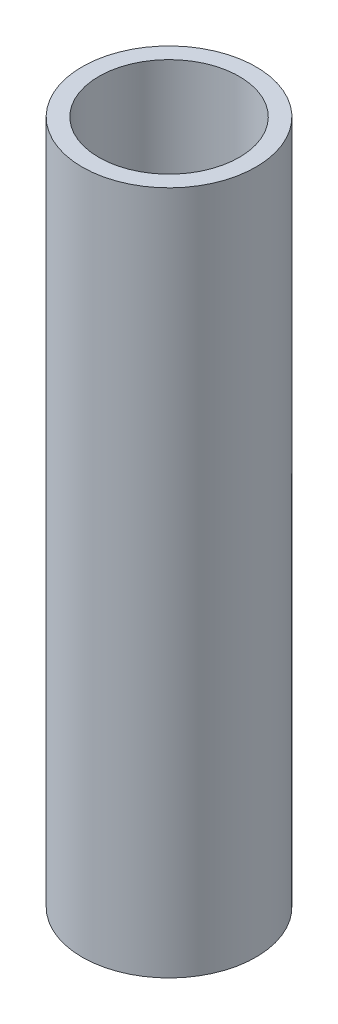
ISO-10303-21;
HEADER;
FILE_DESCRIPTION(('STEP AP214'),'2;1');
FILE_NAME('part.step','',(''),(''),'','','');
FILE_SCHEMA(('AUTOMOTIVE_DESIGN { 1 0 10303 214 1 1 1 1 }'));
ENDSEC;
DATA;
#1=APPLICATION_CONTEXT('core data for automotive mechanical design processes');
#2=APPLICATION_PROTOCOL_DEFINITION('international standard','automotive_design',2000,#1);
#3=PRODUCT_CONTEXT('',#1,'mechanical');
#4=PRODUCT('Part','Part','',(#3));
#5=PRODUCT_RELATED_PRODUCT_CATEGORY('part','',(#4));
#6=PRODUCT_DEFINITION_FORMATION('','',#4);
#7=PRODUCT_DEFINITION_CONTEXT('part definition',#1,'design');
#8=PRODUCT_DEFINITION('design','',#6,#7);
#9=PRODUCT_DEFINITION_SHAPE('','',#8);
#10=(LENGTH_UNIT() NAMED_UNIT(*) SI_UNIT(.MILLI.,.METRE.));
#11=(NAMED_UNIT(*) PLANE_ANGLE_UNIT() SI_UNIT($,.RADIAN.));
#12=(NAMED_UNIT(*) SI_UNIT($,.STERADIAN.) SOLID_ANGLE_UNIT());
#13=UNCERTAINTY_MEASURE_WITH_UNIT(LENGTH_MEASURE(1.E-05),#10,'distance_accuracy_value','');
#14=(GEOMETRIC_REPRESENTATION_CONTEXT(3) GLOBAL_UNCERTAINTY_ASSIGNED_CONTEXT((#13)) GLOBAL_UNIT_ASSIGNED_CONTEXT((#10,
#11,#12)) REPRESENTATION_CONTEXT('',''));
#15=CARTESIAN_POINT('',(0.,0.,0.));
#16=DIRECTION('',(0.,0.,1.));
#17=DIRECTION('',(1.,0.,0.));
#18=AXIS2_PLACEMENT_3D('',#15,#16,#17);
#19=CARTESIAN_POINT('',(0.,26.,0.));
#20=DIRECTION('',(0.,1.,0.));
#21=DIRECTION('',(0.,0.,-1.));
#22=AXIS2_PLACEMENT_3D('',#19,#20,#21);
#23=PLANE('',#22);
#24=CARTESIAN_POINT('',(0.,26.,0.));
#25=DIRECTION('',(0.,-1.,0.));
#26=DIRECTION('',(0.,0.,-1.));
#27=AXIS2_PLACEMENT_3D('',#24,#25,#26);
#28=CIRCLE('',#27,3.302);
#29=CARTESIAN_POINT('',(0.,26.,3.302));
#30=VERTEX_POINT('',#29);
#31=EDGE_CURVE('E10',#30,#30,#28,.T.);
#32=ORIENTED_EDGE('',*,*,#31,.F.);
#33=EDGE_LOOP('',(#32));
#34=FACE_BOUND('',#33,.T.);
#35=CARTESIAN_POINT('',(0.,26.,0.));
#36=DIRECTION('',(0.,-1.,0.));
#37=DIRECTION('',(0.,0.,-1.));
#38=AXIS2_PLACEMENT_3D('',#35,#36,#37);
#39=CIRCLE('',#38,2.667);
#40=CARTESIAN_POINT('',(0.,26.,2.667));
#41=VERTEX_POINT('',#40);
#42=EDGE_CURVE('E49',#41,#41,#39,.T.);
#43=ORIENTED_EDGE('',*,*,#42,.T.);
#44=EDGE_LOOP('',(#43));
#45=FACE_BOUND('',#44,.T.);
#46=ADVANCED_FACE('F36',(#34,#45),#23,.T.);
#47=CARTESIAN_POINT('',(0.,0.,0.));
#48=DIRECTION('',(0.,1.,0.));
#49=DIRECTION('',(0.,0.,-1.));
#50=AXIS2_PLACEMENT_3D('',#47,#48,#49);
#51=PLANE('',#50);
#52=CARTESIAN_POINT('',(0.,0.,0.));
#53=DIRECTION('',(0.,-1.,0.));
#54=DIRECTION('',(0.,0.,-1.));
#55=AXIS2_PLACEMENT_3D('',#52,#53,#54);
#56=CIRCLE('',#55,3.302);
#57=CARTESIAN_POINT('',(0.,0.,3.302));
#58=VERTEX_POINT('',#57);
#59=EDGE_CURVE('E40',#58,#58,#56,.T.);
#60=ORIENTED_EDGE('',*,*,#59,.T.);
#61=EDGE_LOOP('',(#60));
#62=FACE_BOUND('',#61,.T.);
#63=CARTESIAN_POINT('',(0.,0.,0.));
#64=DIRECTION('',(0.,-1.,0.));
#65=DIRECTION('',(0.,0.,-1.));
#66=AXIS2_PLACEMENT_3D('',#63,#64,#65);
#67=CIRCLE('',#66,2.667);
#68=CARTESIAN_POINT('',(0.,0.,2.667));
#69=VERTEX_POINT('',#68);
#70=EDGE_CURVE('E51',#69,#69,#67,.T.);
#71=ORIENTED_EDGE('',*,*,#70,.F.);
#72=EDGE_LOOP('',(#71));
#73=FACE_BOUND('',#72,.T.);
#74=ADVANCED_FACE('F66',(#62,#73),#51,.F.);
#75=CARTESIAN_POINT('',(0.,26.,0.));
#76=DIRECTION('',(0.,-1.,0.));
#77=DIRECTION('',(0.,0.,1.));
#78=AXIS2_PLACEMENT_3D('',#75,#76,#77);
#79=CYLINDRICAL_SURFACE('',#78,3.302);
#80=CARTESIAN_POINT('',(0.,26.,3.302));
#81=CARTESIAN_POINT('',(0.,25.7291666666667,3.302));
#82=CARTESIAN_POINT('',(0.,25.4583333333333,3.302));
#83=CARTESIAN_POINT('',(0.,24.9166666666667,3.302));
#84=CARTESIAN_POINT('',(0.,24.6458333333333,3.302));
#85=CARTESIAN_POINT('',(0.,24.1041666666667,3.302));
#86=CARTESIAN_POINT('',(0.,23.8333333333333,3.302));
#87=CARTESIAN_POINT('',(0.,23.2916666666667,3.302));
#88=CARTESIAN_POINT('',(0.,23.0208333333333,3.302));
#89=CARTESIAN_POINT('',(0.,22.4791666666667,3.302));
#90=CARTESIAN_POINT('',(0.,22.2083333333333,3.302));
#91=CARTESIAN_POINT('',(0.,21.6666666666667,3.302));
#92=CARTESIAN_POINT('',(0.,21.3958333333333,3.302));
#93=CARTESIAN_POINT('',(0.,20.8541666666667,3.302));
#94=CARTESIAN_POINT('',(0.,20.5833333333333,3.302));
#95=CARTESIAN_POINT('',(0.,20.0416666666667,3.302));
#96=CARTESIAN_POINT('',(0.,19.7708333333333,3.302));
#97=CARTESIAN_POINT('',(0.,19.2291666666667,3.302));
#98=CARTESIAN_POINT('',(0.,18.9583333333333,3.302));
#99=CARTESIAN_POINT('',(0.,18.4166666666667,3.302));
#100=CARTESIAN_POINT('',(0.,18.1458333333333,3.302));
#101=CARTESIAN_POINT('',(0.,17.6041666666667,3.302));
#102=CARTESIAN_POINT('',(0.,17.3333333333333,3.302));
#103=CARTESIAN_POINT('',(0.,16.7916666666667,3.302));
#104=CARTESIAN_POINT('',(0.,16.5208333333333,3.302));
#105=CARTESIAN_POINT('',(0.,15.9791666666667,3.302));
#106=CARTESIAN_POINT('',(0.,15.7083333333333,3.302));
#107=CARTESIAN_POINT('',(0.,15.1666666666667,3.302));
#108=CARTESIAN_POINT('',(0.,14.8958333333333,3.302));
#109=CARTESIAN_POINT('',(0.,14.3541666666667,3.302));
#110=CARTESIAN_POINT('',(0.,14.0833333333333,3.302));
#111=CARTESIAN_POINT('',(0.,13.5416666666667,3.302));
#112=CARTESIAN_POINT('',(0.,13.2708333333333,3.302));
#113=CARTESIAN_POINT('',(0.,12.7291666666667,3.302));
#114=CARTESIAN_POINT('',(0.,12.4583333333333,3.302));
#115=CARTESIAN_POINT('',(0.,11.9166666666667,3.302));
#116=CARTESIAN_POINT('',(0.,11.6458333333333,3.302));
#117=CARTESIAN_POINT('',(0.,11.1041666666667,3.302));
#118=CARTESIAN_POINT('',(0.,10.8333333333333,3.302));
#119=CARTESIAN_POINT('',(0.,10.2916666666667,3.302));
#120=CARTESIAN_POINT('',(0.,10.0208333333333,3.302));
#121=CARTESIAN_POINT('',(0.,9.47916666666667,3.302));
#122=CARTESIAN_POINT('',(0.,9.20833333333333,3.302));
#123=CARTESIAN_POINT('',(0.,8.66666666666667,3.302));
#124=CARTESIAN_POINT('',(0.,8.39583333333333,3.302));
#125=CARTESIAN_POINT('',(0.,7.85416666666667,3.302));
#126=CARTESIAN_POINT('',(0.,7.58333333333333,3.302));
#127=CARTESIAN_POINT('',(0.,7.04166666666667,3.302));
#128=CARTESIAN_POINT('',(0.,6.77083333333334,3.302));
#129=CARTESIAN_POINT('',(0.,6.22916666666667,3.302));
#130=CARTESIAN_POINT('',(0.,5.95833333333334,3.302));
#131=CARTESIAN_POINT('',(0.,5.41666666666667,3.302));
#132=CARTESIAN_POINT('',(0.,5.14583333333333,3.302));
#133=CARTESIAN_POINT('',(0.,4.60416666666667,3.302));
#134=CARTESIAN_POINT('',(0.,4.33333333333333,3.302));
#135=CARTESIAN_POINT('',(0.,3.79166666666667,3.302));
#136=CARTESIAN_POINT('',(0.,3.52083333333333,3.302));
#137=CARTESIAN_POINT('',(0.,2.97916666666667,3.302));
#138=CARTESIAN_POINT('',(0.,2.70833333333333,3.302));
#139=CARTESIAN_POINT('',(0.,2.16666666666667,3.302));
#140=CARTESIAN_POINT('',(0.,1.89583333333333,3.302));
#141=CARTESIAN_POINT('',(0.,1.35416666666667,3.302));
#142=CARTESIAN_POINT('',(0.,1.08333333333333,3.302));
#143=CARTESIAN_POINT('',(0.,0.541666666666667,3.302));
#144=CARTESIAN_POINT('',(0.,0.270833333333333,3.302));
#145=CARTESIAN_POINT('',(0.,0.,3.302));
#146=B_SPLINE_CURVE_WITH_KNOTS('',3,(#80,#81,#82,#83,#84,#85,#86,#87,#88,#89,#90,#91,#92,#93,
#94,#95,#96,#97,#98,#99,#100,#101,#102,#103,#104,#105,#106,#107,#108,#109,#110,#111,#112,#113,
#114,#115,#116,#117,#118,#119,#120,#121,#122,#123,#124,#125,#126,#127,#128,#129,#130,#131,#132,
#133,#134,#135,#136,#137,#138,#139,#140,#141,#142,#143,#144,#145),.UNSPECIFIED.,.F.,.F.,(4,2,2,
2,2,2,2,2,2,2,2,2,2,2,2,2,2,2,2,2,2,2,2,2,2,2,2,2,2,2,2,2,4),(0.,0.812500000000001,1.625,2.4375,
3.25,4.0625,4.875,5.6875,6.5,7.3125,8.125,8.9375,9.75,10.5625,11.375,12.1875,13.,13.8125,14.625,
15.4375,16.25,17.0625,17.875,18.6875,19.5,20.3125,21.125,21.9375,22.75,23.5625,24.375,25.1875,
26.),.UNSPECIFIED.);
#147=EDGE_CURVE('BSEAM38',#30,#58,#146,.T.);
#148=ORIENTED_EDGE('',*,*,#31,.T.);
#149=ORIENTED_EDGE('',*,*,#59,.F.);
#150=ORIENTED_EDGE('',*,*,#147,.T.);
#151=ORIENTED_EDGE('',*,*,#147,.F.);
#152=EDGE_LOOP('',(#148,#150,#149,#151));
#153=FACE_BOUND('',#152,.T.);
#154=ADVANCED_FACE('F38',(#153),#79,.T.);
#155=CARTESIAN_POINT('',(0.,26.,0.));
#156=DIRECTION('',(0.,-1.,0.));
#157=DIRECTION('',(0.,0.,1.));
#158=AXIS2_PLACEMENT_3D('',#155,#156,#157);
#159=CYLINDRICAL_SURFACE('',#158,2.667);
#160=CARTESIAN_POINT('',(0.,26.,2.667));
#161=CARTESIAN_POINT('',(0.,25.7291666666667,2.667));
#162=CARTESIAN_POINT('',(0.,25.4583333333333,2.667));
#163=CARTESIAN_POINT('',(0.,24.9166666666667,2.667));
#164=CARTESIAN_POINT('',(0.,24.6458333333333,2.667));
#165=CARTESIAN_POINT('',(0.,24.1041666666667,2.667));
#166=CARTESIAN_POINT('',(0.,23.8333333333333,2.667));
#167=CARTESIAN_POINT('',(0.,23.2916666666667,2.667));
#168=CARTESIAN_POINT('',(0.,23.0208333333333,2.667));
#169=CARTESIAN_POINT('',(0.,22.4791666666667,2.667));
#170=CARTESIAN_POINT('',(0.,22.2083333333333,2.667));
#171=CARTESIAN_POINT('',(0.,21.6666666666667,2.667));
#172=CARTESIAN_POINT('',(0.,21.3958333333333,2.667));
#173=CARTESIAN_POINT('',(0.,20.8541666666667,2.667));
#174=CARTESIAN_POINT('',(0.,20.5833333333333,2.667));
#175=CARTESIAN_POINT('',(0.,20.0416666666667,2.667));
#176=CARTESIAN_POINT('',(0.,19.7708333333333,2.667));
#177=CARTESIAN_POINT('',(0.,19.2291666666667,2.667));
#178=CARTESIAN_POINT('',(0.,18.9583333333333,2.667));
#179=CARTESIAN_POINT('',(0.,18.4166666666667,2.667));
#180=CARTESIAN_POINT('',(0.,18.1458333333333,2.667));
#181=CARTESIAN_POINT('',(0.,17.6041666666667,2.667));
#182=CARTESIAN_POINT('',(0.,17.3333333333333,2.667));
#183=CARTESIAN_POINT('',(0.,16.7916666666667,2.667));
#184=CARTESIAN_POINT('',(0.,16.5208333333333,2.667));
#185=CARTESIAN_POINT('',(0.,15.9791666666667,2.667));
#186=CARTESIAN_POINT('',(0.,15.7083333333333,2.667));
#187=CARTESIAN_POINT('',(0.,15.1666666666667,2.667));
#188=CARTESIAN_POINT('',(0.,14.8958333333333,2.667));
#189=CARTESIAN_POINT('',(0.,14.3541666666667,2.667));
#190=CARTESIAN_POINT('',(0.,14.0833333333333,2.667));
#191=CARTESIAN_POINT('',(0.,13.5416666666667,2.667));
#192=CARTESIAN_POINT('',(0.,13.2708333333333,2.667));
#193=CARTESIAN_POINT('',(0.,12.7291666666667,2.667));
#194=CARTESIAN_POINT('',(0.,12.4583333333333,2.667));
#195=CARTESIAN_POINT('',(0.,11.9166666666667,2.667));
#196=CARTESIAN_POINT('',(0.,11.6458333333333,2.667));
#197=CARTESIAN_POINT('',(0.,11.1041666666667,2.667));
#198=CARTESIAN_POINT('',(0.,10.8333333333333,2.667));
#199=CARTESIAN_POINT('',(0.,10.2916666666667,2.667));
#200=CARTESIAN_POINT('',(0.,10.0208333333333,2.667));
#201=CARTESIAN_POINT('',(0.,9.47916666666667,2.667));
#202=CARTESIAN_POINT('',(0.,9.20833333333333,2.667));
#203=CARTESIAN_POINT('',(0.,8.66666666666667,2.667));
#204=CARTESIAN_POINT('',(0.,8.39583333333333,2.667));
#205=CARTESIAN_POINT('',(0.,7.85416666666667,2.667));
#206=CARTESIAN_POINT('',(0.,7.58333333333333,2.667));
#207=CARTESIAN_POINT('',(0.,7.04166666666667,2.667));
#208=CARTESIAN_POINT('',(0.,6.77083333333334,2.667));
#209=CARTESIAN_POINT('',(0.,6.22916666666667,2.667));
#210=CARTESIAN_POINT('',(0.,5.95833333333334,2.667));
#211=CARTESIAN_POINT('',(0.,5.41666666666667,2.667));
#212=CARTESIAN_POINT('',(0.,5.14583333333333,2.667));
#213=CARTESIAN_POINT('',(0.,4.60416666666667,2.667));
#214=CARTESIAN_POINT('',(0.,4.33333333333333,2.667));
#215=CARTESIAN_POINT('',(0.,3.79166666666667,2.667));
#216=CARTESIAN_POINT('',(0.,3.52083333333333,2.667));
#217=CARTESIAN_POINT('',(0.,2.97916666666667,2.667));
#218=CARTESIAN_POINT('',(0.,2.70833333333333,2.667));
#219=CARTESIAN_POINT('',(0.,2.16666666666667,2.667));
#220=CARTESIAN_POINT('',(0.,1.89583333333333,2.667));
#221=CARTESIAN_POINT('',(0.,1.35416666666667,2.667));
#222=CARTESIAN_POINT('',(0.,1.08333333333333,2.667));
#223=CARTESIAN_POINT('',(0.,0.541666666666667,2.667));
#224=CARTESIAN_POINT('',(0.,0.270833333333333,2.667));
#225=CARTESIAN_POINT('',(0.,0.,2.667));
#226=B_SPLINE_CURVE_WITH_KNOTS('',3,(#160,#161,#162,#163,#164,#165,#166,#167,#168,#169,#170,
#171,#172,#173,#174,#175,#176,#177,#178,#179,#180,#181,#182,#183,#184,#185,#186,#187,#188,#189,
#190,#191,#192,#193,#194,#195,#196,#197,#198,#199,#200,#201,#202,#203,#204,#205,#206,#207,#208,
#209,#210,#211,#212,#213,#214,#215,#216,#217,#218,#219,#220,#221,#222,#223,#224,#225),
.UNSPECIFIED.,.F.,.F.,(4,2,2,2,2,2,2,2,2,2,2,2,2,2,2,2,2,2,2,2,2,2,2,2,2,2,2,2,2,2,2,2,4),(0.,
0.812500000000001,1.625,2.4375,3.25,4.0625,4.875,5.6875,6.5,7.3125,8.125,8.9375,9.75,10.5625,
11.375,12.1875,13.,13.8125,14.625,15.4375,16.25,17.0625,17.875,18.6875,19.5,20.3125,21.125,
21.9375,22.75,23.5625,24.375,25.1875,26.),.UNSPECIFIED.);
#227=EDGE_CURVE('BSEAM60',#41,#69,#226,.T.);
#228=ORIENTED_EDGE('',*,*,#42,.F.);
#229=ORIENTED_EDGE('',*,*,#70,.T.);
#230=ORIENTED_EDGE('',*,*,#227,.T.);
#231=ORIENTED_EDGE('',*,*,#227,.F.);
#232=EDGE_LOOP('',(#228,#230,#229,#231));
#233=FACE_BOUND('',#232,.T.);
#234=ADVANCED_FACE('F60',(#233),#159,.F.);
#235=CLOSED_SHELL('',(#46,#74,#154,#234));
#236=MANIFOLD_SOLID_BREP('B2',#235);
#237=ADVANCED_BREP_SHAPE_REPRESENTATION('',(#18,#236),#14);
#238=SHAPE_DEFINITION_REPRESENTATION(#9,#237);
ENDSEC;
END-ISO-10303-21;
